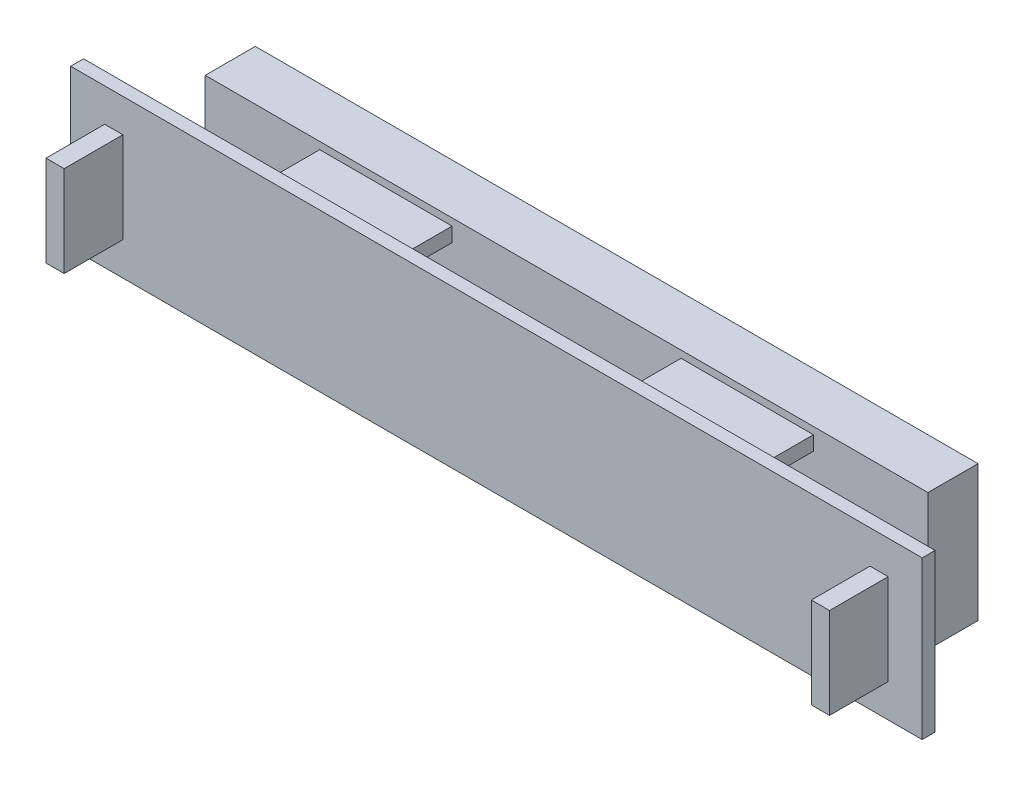
ISO-10303-21;
HEADER;
FILE_DESCRIPTION(('STEP AP214'),'2;1');
FILE_NAME('part.step','',(''),(''),'','','');
FILE_SCHEMA(('AUTOMOTIVE_DESIGN { 1 0 10303 214 1 1 1 1 }'));
ENDSEC;
DATA;
#1=APPLICATION_CONTEXT('core data for automotive mechanical design processes');
#2=APPLICATION_PROTOCOL_DEFINITION('international standard','automotive_design',2000,#1);
#3=PRODUCT_CONTEXT('',#1,'mechanical');
#4=PRODUCT('Part','Part','',(#3));
#5=PRODUCT_RELATED_PRODUCT_CATEGORY('part','',(#4));
#6=PRODUCT_DEFINITION_FORMATION('','',#4);
#7=PRODUCT_DEFINITION_CONTEXT('part definition',#1,'design');
#8=PRODUCT_DEFINITION('design','',#6,#7);
#9=PRODUCT_DEFINITION_SHAPE('','',#8);
#10=(LENGTH_UNIT() NAMED_UNIT(*) SI_UNIT(.MILLI.,.METRE.));
#11=(NAMED_UNIT(*) PLANE_ANGLE_UNIT() SI_UNIT($,.RADIAN.));
#12=(NAMED_UNIT(*) SI_UNIT($,.STERADIAN.) SOLID_ANGLE_UNIT());
#13=UNCERTAINTY_MEASURE_WITH_UNIT(LENGTH_MEASURE(1.E-05),#10,'distance_accuracy_value','');
#14=(GEOMETRIC_REPRESENTATION_CONTEXT(3) GLOBAL_UNCERTAINTY_ASSIGNED_CONTEXT((#13)) GLOBAL_UNIT_ASSIGNED_CONTEXT((#10,
#11,#12)) REPRESENTATION_CONTEXT('',''));
#15=CARTESIAN_POINT('',(0.,0.,0.));
#16=DIRECTION('',(0.,0.,1.));
#17=DIRECTION('',(1.,0.,0.));
#18=AXIS2_PLACEMENT_3D('',#15,#16,#17);
#19=CARTESIAN_POINT('',(0.,0.,15.));
#20=DIRECTION('',(0.,0.,-1.));
#21=DIRECTION('',(-1.,0.,0.));
#22=AXIS2_PLACEMENT_3D('',#19,#20,#21);
#23=PLANE('',#22);
#24=DIRECTION('',(-1.,0.,0.));
#25=VECTOR('',#24,1.);
#26=CARTESIAN_POINT('',(59.5,6.5,15.));
#27=LINE('',#26,#25);
#28=CARTESIAN_POINT('',(-16.,6.5,15.));
#29=VERTEX_POINT('',#28);
#30=CARTESIAN_POINT('',(-34.5,6.5,15.));
#31=VERTEX_POINT('',#30);
#32=EDGE_CURVE('E376',#29,#31,#27,.T.);
#33=ORIENTED_EDGE('',*,*,#32,.F.);
#34=DIRECTION('',(0.,1.,0.));
#35=VECTOR('',#34,1.);
#36=CARTESIAN_POINT('',(-16.,-11.,15.));
#37=LINE('',#36,#35);
#38=CARTESIAN_POINT('',(-16.,8.5,15.));
#39=VERTEX_POINT('',#38);
#40=EDGE_CURVE('E444',#29,#39,#37,.T.);
#41=ORIENTED_EDGE('',*,*,#40,.T.);
#42=DIRECTION('',(-1.,0.,0.));
#43=VECTOR('',#42,1.);
#44=CARTESIAN_POINT('',(59.5,8.5,15.));
#45=LINE('',#44,#43);
#46=CARTESIAN_POINT('',(-34.5,8.5,15.));
#47=VERTEX_POINT('',#46);
#48=EDGE_CURVE('E405',#39,#47,#45,.T.);
#49=ORIENTED_EDGE('',*,*,#48,.T.);
#50=DIRECTION('',(0.,1.,0.));
#51=VECTOR('',#50,1.);
#52=CARTESIAN_POINT('',(-34.5,-11.,15.));
#53=LINE('',#52,#51);
#54=EDGE_CURVE('E421',#31,#47,#53,.T.);
#55=ORIENTED_EDGE('',*,*,#54,.F.);
#56=EDGE_LOOP('',(#33,#41,#49,#55));
#57=FACE_BOUND('',#56,.T.);
#58=DIRECTION('',(0.,1.,0.));
#59=VECTOR('',#58,1.);
#60=CARTESIAN_POINT('',(16.,-11.,15.));
#61=LINE('',#60,#59);
#62=CARTESIAN_POINT('',(16.,6.5,15.));
#63=VERTEX_POINT('',#62);
#64=CARTESIAN_POINT('',(16.,8.5,15.));
#65=VERTEX_POINT('',#64);
#66=EDGE_CURVE('E440',#63,#65,#61,.T.);
#67=ORIENTED_EDGE('',*,*,#66,.F.);
#68=CARTESIAN_POINT('',(34.5,6.5,15.));
#69=VERTEX_POINT('',#68);
#70=EDGE_CURVE('E375',#69,#63,#27,.T.);
#71=ORIENTED_EDGE('',*,*,#70,.F.);
#72=DIRECTION('',(0.,1.,0.));
#73=VECTOR('',#72,1.);
#74=CARTESIAN_POINT('',(34.5,-11.,15.));
#75=LINE('',#74,#73);
#76=CARTESIAN_POINT('',(34.5,8.49999999999999,15.));
#77=VERTEX_POINT('',#76);
#78=EDGE_CURVE('E434',#69,#77,#75,.T.);
#79=ORIENTED_EDGE('',*,*,#78,.T.);
#80=EDGE_CURVE('E408',#77,#65,#45,.T.);
#81=ORIENTED_EDGE('',*,*,#80,.T.);
#82=EDGE_LOOP('',(#67,#71,#79,#81));
#83=FACE_BOUND('',#82,.T.);
#84=DIRECTION('',(-1.,0.,0.));
#85=VECTOR('',#84,1.);
#86=CARTESIAN_POINT('',(59.5,-8.5,15.));
#87=LINE('',#86,#85);
#88=CARTESIAN_POINT('',(-16.,-8.5,15.));
#89=VERTEX_POINT('',#88);
#90=CARTESIAN_POINT('',(-34.5,-8.5,15.));
#91=VERTEX_POINT('',#90);
#92=EDGE_CURVE('E351',#89,#91,#87,.T.);
#93=ORIENTED_EDGE('',*,*,#92,.F.);
#94=CARTESIAN_POINT('',(-16.,-6.5,15.));
#95=VERTEX_POINT('',#94);
#96=EDGE_CURVE('E441',#89,#95,#37,.T.);
#97=ORIENTED_EDGE('',*,*,#96,.T.);
#98=DIRECTION('',(-1.,0.,0.));
#99=VECTOR('',#98,1.);
#100=CARTESIAN_POINT('',(59.5,-6.5,15.));
#101=LINE('',#100,#99);
#102=CARTESIAN_POINT('',(-34.5,-6.5,15.));
#103=VERTEX_POINT('',#102);
#104=EDGE_CURVE('E379',#95,#103,#101,.T.);
#105=ORIENTED_EDGE('',*,*,#104,.T.);
#106=EDGE_CURVE('E429',#91,#103,#53,.T.);
#107=ORIENTED_EDGE('',*,*,#106,.F.);
#108=EDGE_LOOP('',(#93,#97,#105,#107));
#109=FACE_BOUND('',#108,.T.);
#110=DIRECTION('',(-1.,0.,0.));
#111=VECTOR('',#110,1.);
#112=CARTESIAN_POINT('',(-59.5,11.,15.));
#113=LINE('',#112,#111);
#114=CARTESIAN_POINT('',(59.5,11.,15.));
#115=VERTEX_POINT('',#114);
#116=CARTESIAN_POINT('',(-59.5,11.,15.));
#117=VERTEX_POINT('',#116);
#118=EDGE_CURVE('E465',#115,#117,#113,.T.);
#119=ORIENTED_EDGE('',*,*,#118,.F.);
#120=DIRECTION('',(0.,1.,0.));
#121=VECTOR('',#120,1.);
#122=CARTESIAN_POINT('',(59.5,-11.,15.));
#123=LINE('',#122,#121);
#124=CARTESIAN_POINT('',(59.5,-11.,15.));
#125=VERTEX_POINT('',#124);
#126=EDGE_CURVE('E443',#125,#115,#123,.T.);
#127=ORIENTED_EDGE('',*,*,#126,.F.);
#128=DIRECTION('',(1.,0.,0.));
#129=VECTOR('',#128,1.);
#130=CARTESIAN_POINT('',(-59.5,-11.,15.));
#131=LINE('',#130,#129);
#132=CARTESIAN_POINT('',(-59.5,-11.,15.));
#133=VERTEX_POINT('',#132);
#134=EDGE_CURVE('E457',#133,#125,#131,.T.);
#135=ORIENTED_EDGE('',*,*,#134,.F.);
#136=DIRECTION('',(0.,-1.,0.));
#137=VECTOR('',#136,1.);
#138=CARTESIAN_POINT('',(-59.5,-11.,15.));
#139=LINE('',#138,#137);
#140=EDGE_CURVE('E467',#117,#133,#139,.T.);
#141=ORIENTED_EDGE('',*,*,#140,.F.);
#142=EDGE_LOOP('',(#119,#127,#135,#141));
#143=FACE_BOUND('',#142,.T.);
#144=CARTESIAN_POINT('',(16.,-8.5,15.));
#145=VERTEX_POINT('',#144);
#146=CARTESIAN_POINT('',(16.,-6.5,15.));
#147=VERTEX_POINT('',#146);
#148=EDGE_CURVE('E451',#145,#147,#61,.T.);
#149=ORIENTED_EDGE('',*,*,#148,.F.);
#150=CARTESIAN_POINT('',(34.5,-8.5,15.));
#151=VERTEX_POINT('',#150);
#152=EDGE_CURVE('E355',#151,#145,#87,.T.);
#153=ORIENTED_EDGE('',*,*,#152,.F.);
#154=CARTESIAN_POINT('',(34.5,-6.5,15.));
#155=VERTEX_POINT('',#154);
#156=EDGE_CURVE('E431',#151,#155,#75,.T.);
#157=ORIENTED_EDGE('',*,*,#156,.T.);
#158=EDGE_CURVE('E378',#155,#147,#101,.T.);
#159=ORIENTED_EDGE('',*,*,#158,.T.);
#160=EDGE_LOOP('',(#149,#153,#157,#159));
#161=FACE_BOUND('',#160,.T.);
#162=DIRECTION('',(-1.,0.,0.));
#163=VECTOR('',#162,1.);
#164=CARTESIAN_POINT('',(-14.,-5.,15.));
#165=LINE('',#164,#163);
#166=CARTESIAN_POINT('',(14.,-5.,15.));
#167=VERTEX_POINT('',#166);
#168=CARTESIAN_POINT('',(-14.,-5.,15.));
#169=VERTEX_POINT('',#168);
#170=EDGE_CURVE('E333',#167,#169,#165,.T.);
#171=ORIENTED_EDGE('',*,*,#170,.F.);
#172=DIRECTION('',(0.,-1.,0.));
#173=VECTOR('',#172,1.);
#174=CARTESIAN_POINT('',(14.,5.,15.));
#175=LINE('',#174,#173);
#176=CARTESIAN_POINT('',(14.,5.,15.));
#177=VERTEX_POINT('',#176);
#178=EDGE_CURVE('E313',#177,#167,#175,.T.);
#179=ORIENTED_EDGE('',*,*,#178,.F.);
#180=DIRECTION('',(1.,0.,0.));
#181=VECTOR('',#180,1.);
#182=CARTESIAN_POINT('',(-14.,5.,15.));
#183=LINE('',#182,#181);
#184=CARTESIAN_POINT('',(-14.,5.,15.));
#185=VERTEX_POINT('',#184);
#186=EDGE_CURVE('E324',#185,#177,#183,.T.);
#187=ORIENTED_EDGE('',*,*,#186,.F.);
#188=DIRECTION('',(0.,1.,0.));
#189=VECTOR('',#188,1.);
#190=CARTESIAN_POINT('',(-14.,5.,15.));
#191=LINE('',#190,#189);
#192=EDGE_CURVE('E335',#169,#185,#191,.T.);
#193=ORIENTED_EDGE('',*,*,#192,.F.);
#194=EDGE_LOOP('',(#171,#179,#187,#193));
#195=FACE_BOUND('',#194,.T.);
#196=ADVANCED_FACE('F35',(#57,#83,#109,#143,#161,#195),#23,.T.);
#197=CARTESIAN_POINT('',(-16.,-11.,0.));
#198=DIRECTION('',(1.,0.,0.));
#199=DIRECTION('',(0.,0.,-1.));
#200=AXIS2_PLACEMENT_3D('',#197,#198,#199);
#201=PLANE('',#200);
#202=DIRECTION('',(0.,0.,1.));
#203=VECTOR('',#202,1.);
#204=CARTESIAN_POINT('',(-16.,6.5,0.));
#205=LINE('',#204,#203);
#206=CARTESIAN_POINT('',(-16.,6.5,7.));
#207=VERTEX_POINT('',#206);
#208=EDGE_CURVE('E399',#207,#29,#205,.T.);
#209=ORIENTED_EDGE('',*,*,#208,.F.);
#210=DIRECTION('',(0.,1.,0.));
#211=VECTOR('',#210,1.);
#212=CARTESIAN_POINT('',(-16.,-11.,7.));
#213=LINE('',#212,#211);
#214=CARTESIAN_POINT('',(-16.,8.5,7.));
#215=VERTEX_POINT('',#214);
#216=EDGE_CURVE('E447',#207,#215,#213,.T.);
#217=ORIENTED_EDGE('',*,*,#216,.T.);
#218=DIRECTION('',(0.,0.,-1.));
#219=VECTOR('',#218,1.);
#220=CARTESIAN_POINT('',(-16.,8.5,0.));
#221=LINE('',#220,#219);
#222=EDGE_CURVE('E418',#39,#215,#221,.T.);
#223=ORIENTED_EDGE('',*,*,#222,.F.);
#224=ORIENTED_EDGE('',*,*,#40,.F.);
#225=EDGE_LOOP('',(#209,#217,#223,#224));
#226=FACE_BOUND('',#225,.T.);
#227=ADVANCED_FACE('F535',(#226),#201,.T.);
#228=CARTESIAN_POINT('',(16.,-11.,0.));
#229=DIRECTION('',(1.,0.,0.));
#230=DIRECTION('',(0.,0.,-1.));
#231=AXIS2_PLACEMENT_3D('',#228,#229,#230);
#232=PLANE('',#231);
#233=DIRECTION('',(0.,1.,0.));
#234=VECTOR('',#233,1.);
#235=CARTESIAN_POINT('',(16.,-11.,6.99999999999999));
#236=LINE('',#235,#234);
#237=CARTESIAN_POINT('',(16.,6.5,7.));
#238=VERTEX_POINT('',#237);
#239=CARTESIAN_POINT('',(16.,8.5,7.));
#240=VERTEX_POINT('',#239);
#241=EDGE_CURVE('E450',#238,#240,#236,.T.);
#242=ORIENTED_EDGE('',*,*,#241,.F.);
#243=DIRECTION('',(0.,0.,1.));
#244=VECTOR('',#243,1.);
#245=CARTESIAN_POINT('',(16.,6.5,0.));
#246=LINE('',#245,#244);
#247=EDGE_CURVE('E396',#238,#63,#246,.T.);
#248=ORIENTED_EDGE('',*,*,#247,.T.);
#249=ORIENTED_EDGE('',*,*,#66,.T.);
#250=DIRECTION('',(0.,0.,-1.));
#251=VECTOR('',#250,1.);
#252=CARTESIAN_POINT('',(16.,8.5,0.));
#253=LINE('',#252,#251);
#254=EDGE_CURVE('E415',#65,#240,#253,.T.);
#255=ORIENTED_EDGE('',*,*,#254,.T.);
#256=EDGE_LOOP('',(#242,#248,#249,#255));
#257=FACE_BOUND('',#256,.T.);
#258=ADVANCED_FACE('F541',(#257),#232,.F.);
#259=CARTESIAN_POINT('',(34.5,-11.,0.));
#260=DIRECTION('',(1.,0.,0.));
#261=DIRECTION('',(0.,0.,-1.));
#262=AXIS2_PLACEMENT_3D('',#259,#260,#261);
#263=PLANE('',#262);
#264=DIRECTION('',(0.,0.,1.));
#265=VECTOR('',#264,1.);
#266=CARTESIAN_POINT('',(34.5,6.5,0.));
#267=LINE('',#266,#265);
#268=CARTESIAN_POINT('',(34.5,6.5,7.));
#269=VERTEX_POINT('',#268);
#270=EDGE_CURVE('E394',#269,#69,#267,.T.);
#271=ORIENTED_EDGE('',*,*,#270,.F.);
#272=DIRECTION('',(0.,1.,0.));
#273=VECTOR('',#272,1.);
#274=CARTESIAN_POINT('',(34.5,-11.,6.99999999999999));
#275=LINE('',#274,#273);
#276=CARTESIAN_POINT('',(34.5,8.5,7.));
#277=VERTEX_POINT('',#276);
#278=EDGE_CURVE('E437',#269,#277,#275,.T.);
#279=ORIENTED_EDGE('',*,*,#278,.T.);
#280=DIRECTION('',(0.,0.,-1.));
#281=VECTOR('',#280,1.);
#282=CARTESIAN_POINT('',(34.5,8.5,0.));
#283=LINE('',#282,#281);
#284=EDGE_CURVE('E412',#77,#277,#283,.T.);
#285=ORIENTED_EDGE('',*,*,#284,.F.);
#286=ORIENTED_EDGE('',*,*,#78,.F.);
#287=EDGE_LOOP('',(#271,#279,#285,#286));
#288=FACE_BOUND('',#287,.T.);
#289=ADVANCED_FACE('F584',(#288),#263,.T.);
#290=CARTESIAN_POINT('',(-34.5,-11.,0.));
#291=DIRECTION('',(1.,0.,0.));
#292=DIRECTION('',(0.,0.,-1.));
#293=AXIS2_PLACEMENT_3D('',#290,#291,#292);
#294=PLANE('',#293);
#295=DIRECTION('',(0.,1.,0.));
#296=VECTOR('',#295,1.);
#297=CARTESIAN_POINT('',(-34.5,-11.,7.));
#298=LINE('',#297,#296);
#299=CARTESIAN_POINT('',(-34.5,6.5,7.));
#300=VERTEX_POINT('',#299);
#301=CARTESIAN_POINT('',(-34.5,8.49999999999999,7.));
#302=VERTEX_POINT('',#301);
#303=EDGE_CURVE('E428',#300,#302,#298,.T.);
#304=ORIENTED_EDGE('',*,*,#303,.F.);
#305=DIRECTION('',(0.,0.,-1.));
#306=VECTOR('',#305,1.);
#307=CARTESIAN_POINT('',(-34.5,6.5,7.));
#308=LINE('',#307,#306);
#309=EDGE_CURVE('E368',#31,#300,#308,.T.);
#310=ORIENTED_EDGE('',*,*,#309,.F.);
#311=ORIENTED_EDGE('',*,*,#54,.T.);
#312=DIRECTION('',(0.,0.,1.));
#313=VECTOR('',#312,1.);
#314=CARTESIAN_POINT('',(-34.5,8.5,7.));
#315=LINE('',#314,#313);
#316=EDGE_CURVE('E401',#302,#47,#315,.T.);
#317=ORIENTED_EDGE('',*,*,#316,.F.);
#318=EDGE_LOOP('',(#304,#310,#311,#317));
#319=FACE_BOUND('',#318,.T.);
#320=ADVANCED_FACE('F579',(#319),#294,.F.);
#321=CARTESIAN_POINT('',(-50.5,9.5,15.));
#322=DIRECTION('',(0.,-1.,0.));
#323=DIRECTION('',(0.,0.,-1.));
#324=AXIS2_PLACEMENT_3D('',#321,#322,#323);
#325=PLANE('',#324);
#326=DIRECTION('',(0.,0.,-1.));
#327=VECTOR('',#326,1.);
#328=CARTESIAN_POINT('',(-50.5,9.5,15.));
#329=LINE('',#328,#327);
#330=CARTESIAN_POINT('',(-50.5,9.5,7.));
#331=VERTEX_POINT('',#330);
#332=CARTESIAN_POINT('',(-50.5,9.5,0.));
#333=VERTEX_POINT('',#332);
#334=EDGE_CURVE('E497',#331,#333,#329,.T.);
#335=ORIENTED_EDGE('',*,*,#334,.F.);
#336=DIRECTION('',(-1.,0.,0.));
#337=VECTOR('',#336,1.);
#338=CARTESIAN_POINT('',(0.,9.5,6.99999999999999));
#339=LINE('',#338,#337);
#340=CARTESIAN_POINT('',(50.5,9.5,6.99999999999999));
#341=VERTEX_POINT('',#340);
#342=EDGE_CURVE('E433',#341,#331,#339,.T.);
#343=ORIENTED_EDGE('',*,*,#342,.F.);
#344=DIRECTION('',(0.,0.,-1.));
#345=VECTOR('',#344,1.);
#346=CARTESIAN_POINT('',(50.5,9.5,15.));
#347=LINE('',#346,#345);
#348=CARTESIAN_POINT('',(50.5,9.5,0.));
#349=VERTEX_POINT('',#348);
#350=EDGE_CURVE('E499',#341,#349,#347,.T.);
#351=ORIENTED_EDGE('',*,*,#350,.T.);
#352=DIRECTION('',(-1.,0.,0.));
#353=VECTOR('',#352,1.);
#354=CARTESIAN_POINT('',(-50.5,9.5,0.));
#355=LINE('',#354,#353);
#356=EDGE_CURVE('E484',#349,#333,#355,.T.);
#357=ORIENTED_EDGE('',*,*,#356,.T.);
#358=EDGE_LOOP('',(#335,#343,#351,#357));
#359=FACE_BOUND('',#358,.T.);
#360=ADVANCED_FACE('F574',(#359),#325,.F.);
#361=CARTESIAN_POINT('',(-50.5,-9.5,15.));
#362=DIRECTION('',(0.,1.,0.));
#363=DIRECTION('',(0.,0.,1.));
#364=AXIS2_PLACEMENT_3D('',#361,#362,#363);
#365=PLANE('',#364);
#366=DIRECTION('',(0.,0.,-1.));
#367=VECTOR('',#366,1.);
#368=CARTESIAN_POINT('',(50.5,-9.5,15.));
#369=LINE('',#368,#367);
#370=CARTESIAN_POINT('',(50.5,-9.5,6.99999999999999));
#371=VERTEX_POINT('',#370);
#372=CARTESIAN_POINT('',(50.5,-9.5,0.));
#373=VERTEX_POINT('',#372);
#374=EDGE_CURVE('E493',#371,#373,#369,.T.);
#375=ORIENTED_EDGE('',*,*,#374,.F.);
#376=DIRECTION('',(-1.,0.,0.));
#377=VECTOR('',#376,1.);
#378=CARTESIAN_POINT('',(-50.5,-9.5,7.));
#379=LINE('',#378,#377);
#380=CARTESIAN_POINT('',(-50.5,-9.5,7.));
#381=VERTEX_POINT('',#380);
#382=EDGE_CURVE('E501',#371,#381,#379,.T.);
#383=ORIENTED_EDGE('',*,*,#382,.T.);
#384=DIRECTION('',(0.,0.,-1.));
#385=VECTOR('',#384,1.);
#386=CARTESIAN_POINT('',(-50.5,-9.5,15.));
#387=LINE('',#386,#385);
#388=CARTESIAN_POINT('',(-50.5,-9.5,0.));
#389=VERTEX_POINT('',#388);
#390=EDGE_CURVE('E495',#381,#389,#387,.T.);
#391=ORIENTED_EDGE('',*,*,#390,.T.);
#392=DIRECTION('',(1.,0.,0.));
#393=VECTOR('',#392,1.);
#394=CARTESIAN_POINT('',(-50.5,-9.5,0.));
#395=LINE('',#394,#393);
#396=EDGE_CURVE('E490',#389,#373,#395,.T.);
#397=ORIENTED_EDGE('',*,*,#396,.T.);
#398=EDGE_LOOP('',(#375,#383,#391,#397));
#399=FACE_BOUND('',#398,.T.);
#400=ADVANCED_FACE('F570',(#399),#365,.F.);
#401=CARTESIAN_POINT('',(-50.5,-9.5,15.));
#402=DIRECTION('',(1.,0.,0.));
#403=DIRECTION('',(0.,0.,-1.));
#404=AXIS2_PLACEMENT_3D('',#401,#402,#403);
#405=PLANE('',#404);
#406=DIRECTION('',(0.,1.,0.));
#407=VECTOR('',#406,1.);
#408=CARTESIAN_POINT('',(-50.5,-11.,7.));
#409=LINE('',#408,#407);
#410=EDGE_CURVE('E422',#381,#331,#409,.T.);
#411=ORIENTED_EDGE('',*,*,#410,.T.);
#412=ORIENTED_EDGE('',*,*,#334,.T.);
#413=DIRECTION('',(0.,-1.,0.));
#414=VECTOR('',#413,1.);
#415=CARTESIAN_POINT('',(-50.5,-9.5,0.));
#416=LINE('',#415,#414);
#417=EDGE_CURVE('E487',#333,#389,#416,.T.);
#418=ORIENTED_EDGE('',*,*,#417,.T.);
#419=ORIENTED_EDGE('',*,*,#390,.F.);
#420=EDGE_LOOP('',(#411,#412,#418,#419));
#421=FACE_BOUND('',#420,.T.);
#422=ADVANCED_FACE('F573',(#421),#405,.F.);
#423=CARTESIAN_POINT('',(50.5,-9.5,15.));
#424=DIRECTION('',(-1.,0.,0.));
#425=DIRECTION('',(0.,0.,1.));
#426=AXIS2_PLACEMENT_3D('',#423,#424,#425);
#427=PLANE('',#426);
#428=ORIENTED_EDGE('',*,*,#350,.F.);
#429=DIRECTION('',(0.,1.,0.));
#430=VECTOR('',#429,1.);
#431=CARTESIAN_POINT('',(50.5,-11.,6.99999999999999));
#432=LINE('',#431,#430);
#433=EDGE_CURVE('E425',#371,#341,#432,.T.);
#434=ORIENTED_EDGE('',*,*,#433,.F.);
#435=ORIENTED_EDGE('',*,*,#374,.T.);
#436=DIRECTION('',(0.,1.,0.));
#437=VECTOR('',#436,1.);
#438=CARTESIAN_POINT('',(50.5,-9.5,0.));
#439=LINE('',#438,#437);
#440=EDGE_CURVE('E481',#373,#349,#439,.T.);
#441=ORIENTED_EDGE('',*,*,#440,.T.);
#442=EDGE_LOOP('',(#428,#434,#435,#441));
#443=FACE_BOUND('',#442,.T.);
#444=ADVANCED_FACE('F37',(#443),#427,.F.);
#445=CARTESIAN_POINT('',(0.,0.,0.));
#446=DIRECTION('',(0.,0.,-1.));
#447=DIRECTION('',(-1.,0.,0.));
#448=AXIS2_PLACEMENT_3D('',#445,#446,#447);
#449=PLANE('',#448);
#450=ORIENTED_EDGE('',*,*,#440,.F.);
#451=ORIENTED_EDGE('',*,*,#396,.F.);
#452=ORIENTED_EDGE('',*,*,#417,.F.);
#453=ORIENTED_EDGE('',*,*,#356,.F.);
#454=EDGE_LOOP('',(#450,#451,#452,#453));
#455=FACE_BOUND('',#454,.T.);
#456=ADVANCED_FACE('F565',(#455),#449,.T.);
#457=CARTESIAN_POINT('',(59.5,-11.,16.8));
#458=DIRECTION('',(-1.,0.,0.));
#459=DIRECTION('',(0.,0.,1.));
#460=AXIS2_PLACEMENT_3D('',#457,#458,#459);
#461=PLANE('',#460);
#462=ORIENTED_EDGE('',*,*,#126,.T.);
#463=DIRECTION('',(0.,0.,-1.));
#464=VECTOR('',#463,1.);
#465=CARTESIAN_POINT('',(59.5,11.,16.8));
#466=LINE('',#465,#464);
#467=CARTESIAN_POINT('',(59.5,11.,16.8));
#468=VERTEX_POINT('',#467);
#469=EDGE_CURVE('E478',#468,#115,#466,.T.);
#470=ORIENTED_EDGE('',*,*,#469,.F.);
#471=DIRECTION('',(0.,1.,0.));
#472=VECTOR('',#471,1.);
#473=CARTESIAN_POINT('',(59.5,-11.,16.8));
#474=LINE('',#473,#472);
#475=CARTESIAN_POINT('',(59.5,-11.,16.8));
#476=VERTEX_POINT('',#475);
#477=EDGE_CURVE('E453',#476,#468,#474,.T.);
#478=ORIENTED_EDGE('',*,*,#477,.F.);
#479=DIRECTION('',(0.,0.,-1.));
#480=VECTOR('',#479,1.);
#481=CARTESIAN_POINT('',(59.5,-11.,16.8));
#482=LINE('',#481,#480);
#483=EDGE_CURVE('E463',#476,#125,#482,.T.);
#484=ORIENTED_EDGE('',*,*,#483,.T.);
#485=EDGE_LOOP('',(#462,#470,#478,#484));
#486=FACE_BOUND('',#485,.T.);
#487=ADVANCED_FACE('F561',(#486),#461,.F.);
#488=CARTESIAN_POINT('',(-59.5,11.,16.8));
#489=DIRECTION('',(0.,-1.,0.));
#490=DIRECTION('',(0.,0.,-1.));
#491=AXIS2_PLACEMENT_3D('',#488,#489,#490);
#492=PLANE('',#491);
#493=ORIENTED_EDGE('',*,*,#118,.T.);
#494=DIRECTION('',(0.,0.,-1.));
#495=VECTOR('',#494,1.);
#496=CARTESIAN_POINT('',(-59.5,11.,16.8));
#497=LINE('',#496,#495);
#498=CARTESIAN_POINT('',(-59.5,11.,16.8));
#499=VERTEX_POINT('',#498);
#500=EDGE_CURVE('E475',#499,#117,#497,.T.);
#501=ORIENTED_EDGE('',*,*,#500,.F.);
#502=DIRECTION('',(-1.,0.,0.));
#503=VECTOR('',#502,1.);
#504=CARTESIAN_POINT('',(-59.5,11.,16.8));
#505=LINE('',#504,#503);
#506=EDGE_CURVE('E456',#468,#499,#505,.T.);
#507=ORIENTED_EDGE('',*,*,#506,.F.);
#508=ORIENTED_EDGE('',*,*,#469,.T.);
#509=EDGE_LOOP('',(#493,#501,#507,#508));
#510=FACE_BOUND('',#509,.T.);
#511=ADVANCED_FACE('F557',(#510),#492,.F.);
#512=CARTESIAN_POINT('',(-59.5,-11.,16.8));
#513=DIRECTION('',(1.,0.,0.));
#514=DIRECTION('',(0.,0.,-1.));
#515=AXIS2_PLACEMENT_3D('',#512,#513,#514);
#516=PLANE('',#515);
#517=ORIENTED_EDGE('',*,*,#140,.T.);
#518=DIRECTION('',(0.,0.,-1.));
#519=VECTOR('',#518,1.);
#520=CARTESIAN_POINT('',(-59.5,-11.,16.8));
#521=LINE('',#520,#519);
#522=CARTESIAN_POINT('',(-59.5,-11.,16.8));
#523=VERTEX_POINT('',#522);
#524=EDGE_CURVE('E472',#523,#133,#521,.T.);
#525=ORIENTED_EDGE('',*,*,#524,.F.);
#526=DIRECTION('',(0.,-1.,0.));
#527=VECTOR('',#526,1.);
#528=CARTESIAN_POINT('',(-59.5,-11.,16.8));
#529=LINE('',#528,#527);
#530=EDGE_CURVE('E459',#499,#523,#529,.T.);
#531=ORIENTED_EDGE('',*,*,#530,.F.);
#532=ORIENTED_EDGE('',*,*,#500,.T.);
#533=EDGE_LOOP('',(#517,#525,#531,#532));
#534=FACE_BOUND('',#533,.T.);
#535=ADVANCED_FACE('F553',(#534),#516,.F.);
#536=CARTESIAN_POINT('',(-59.5,-11.,16.8));
#537=DIRECTION('',(0.,1.,0.));
#538=DIRECTION('',(0.,0.,1.));
#539=AXIS2_PLACEMENT_3D('',#536,#537,#538);
#540=PLANE('',#539);
#541=ORIENTED_EDGE('',*,*,#134,.T.);
#542=ORIENTED_EDGE('',*,*,#483,.F.);
#543=DIRECTION('',(1.,0.,0.));
#544=VECTOR('',#543,1.);
#545=CARTESIAN_POINT('',(-59.5,-11.,16.8));
#546=LINE('',#545,#544);
#547=EDGE_CURVE('E461',#523,#476,#546,.T.);
#548=ORIENTED_EDGE('',*,*,#547,.F.);
#549=ORIENTED_EDGE('',*,*,#524,.T.);
#550=EDGE_LOOP('',(#541,#542,#548,#549));
#551=FACE_BOUND('',#550,.T.);
#552=ADVANCED_FACE('F550',(#551),#540,.F.);
#553=CARTESIAN_POINT('',(0.,0.,16.8));
#554=DIRECTION('',(0.,0.,-1.));
#555=DIRECTION('',(-1.,0.,0.));
#556=AXIS2_PLACEMENT_3D('',#553,#554,#555);
#557=PLANE('',#556);
#558=DIRECTION('',(0.,1.,0.));
#559=VECTOR('',#558,1.);
#560=CARTESIAN_POINT('',(-54.75,0.,16.8));
#561=LINE('',#560,#559);
#562=CARTESIAN_POINT('',(-54.75,-6.35,16.8));
#563=VERTEX_POINT('',#562);
#564=CARTESIAN_POINT('',(-54.75,6.35,16.8));
#565=VERTEX_POINT('',#564);
#566=EDGE_CURVE('E43',#563,#565,#561,.T.);
#567=ORIENTED_EDGE('',*,*,#566,.T.);
#568=DIRECTION('',(1.,0.,0.));
#569=VECTOR('',#568,1.);
#570=CARTESIAN_POINT('',(0.,6.35,16.8));
#571=LINE('',#570,#569);
#572=CARTESIAN_POINT('',(-52.21,6.35,16.8));
#573=VERTEX_POINT('',#572);
#574=EDGE_CURVE('E11',#565,#573,#571,.T.);
#575=ORIENTED_EDGE('',*,*,#574,.T.);
#576=DIRECTION('',(0.,-1.,0.));
#577=VECTOR('',#576,1.);
#578=CARTESIAN_POINT('',(-52.21,0.,16.8));
#579=LINE('',#578,#577);
#580=CARTESIAN_POINT('',(-52.21,-6.35,16.8));
#581=VERTEX_POINT('',#580);
#582=EDGE_CURVE('E271',#573,#581,#579,.T.);
#583=ORIENTED_EDGE('',*,*,#582,.T.);
#584=DIRECTION('',(-1.,0.,0.));
#585=VECTOR('',#584,1.);
#586=CARTESIAN_POINT('',(0.,-6.35,16.8));
#587=LINE('',#586,#585);
#588=EDGE_CURVE('E516',#581,#563,#587,.T.);
#589=ORIENTED_EDGE('',*,*,#588,.T.);
#590=EDGE_LOOP('',(#567,#575,#583,#589));
#591=FACE_BOUND('',#590,.T.);
#592=DIRECTION('',(1.,0.,0.));
#593=VECTOR('',#592,1.);
#594=CARTESIAN_POINT('',(0.,6.35,16.8));
#595=LINE('',#594,#593);
#596=CARTESIAN_POINT('',(52.21,6.35,16.8));
#597=VERTEX_POINT('',#596);
#598=CARTESIAN_POINT('',(54.75,6.35,16.8));
#599=VERTEX_POINT('',#598);
#600=EDGE_CURVE('E509',#597,#599,#595,.T.);
#601=ORIENTED_EDGE('',*,*,#600,.T.);
#602=DIRECTION('',(0.,-1.,0.));
#603=VECTOR('',#602,1.);
#604=CARTESIAN_POINT('',(54.75,0.,16.8));
#605=LINE('',#604,#603);
#606=CARTESIAN_POINT('',(54.75,-6.35,16.8));
#607=VERTEX_POINT('',#606);
#608=EDGE_CURVE('E512',#599,#607,#605,.T.);
#609=ORIENTED_EDGE('',*,*,#608,.T.);
#610=DIRECTION('',(-1.,0.,0.));
#611=VECTOR('',#610,1.);
#612=CARTESIAN_POINT('',(0.,-6.35,16.8));
#613=LINE('',#612,#611);
#614=CARTESIAN_POINT('',(52.21,-6.35,16.8));
#615=VERTEX_POINT('',#614);
#616=EDGE_CURVE('E503',#607,#615,#613,.T.);
#617=ORIENTED_EDGE('',*,*,#616,.T.);
#618=DIRECTION('',(0.,1.,0.));
#619=VECTOR('',#618,1.);
#620=CARTESIAN_POINT('',(52.21,0.,16.8));
#621=LINE('',#620,#619);
#622=EDGE_CURVE('E506',#615,#597,#621,.T.);
#623=ORIENTED_EDGE('',*,*,#622,.T.);
#624=EDGE_LOOP('',(#601,#609,#617,#623));
#625=FACE_BOUND('',#624,.T.);
#626=ORIENTED_EDGE('',*,*,#477,.T.);
#627=ORIENTED_EDGE('',*,*,#506,.T.);
#628=ORIENTED_EDGE('',*,*,#530,.T.);
#629=ORIENTED_EDGE('',*,*,#547,.T.);
#630=EDGE_LOOP('',(#626,#627,#628,#629));
#631=FACE_BOUND('',#630,.T.);
#632=ADVANCED_FACE('F520',(#591,#625,#631),#557,.F.);
#633=CARTESIAN_POINT('',(0.,-11.,6.99999999999999));
#634=DIRECTION('',(0.,0.,-1.));
#635=DIRECTION('',(-1.,0.,0.));
#636=AXIS2_PLACEMENT_3D('',#633,#634,#635);
#637=PLANE('',#636);
#638=DIRECTION('',(-1.,0.,0.));
#639=VECTOR('',#638,1.);
#640=CARTESIAN_POINT('',(59.5,-8.5,7.));
#641=LINE('',#640,#639);
#642=CARTESIAN_POINT('',(34.5,-8.5,7.));
#643=VERTEX_POINT('',#642);
#644=CARTESIAN_POINT('',(16.,-8.5,7.));
#645=VERTEX_POINT('',#644);
#646=EDGE_CURVE('E354',#643,#645,#641,.T.);
#647=ORIENTED_EDGE('',*,*,#646,.T.);
#648=CARTESIAN_POINT('',(16.,-6.5,6.99999999999999));
#649=VERTEX_POINT('',#648);
#650=EDGE_CURVE('E448',#645,#649,#236,.T.);
#651=ORIENTED_EDGE('',*,*,#650,.T.);
#652=DIRECTION('',(-1.,0.,0.));
#653=VECTOR('',#652,1.);
#654=CARTESIAN_POINT('',(59.5,-6.5,7.));
#655=LINE('',#654,#653);
#656=CARTESIAN_POINT('',(34.5,-6.5,7.));
#657=VERTEX_POINT('',#656);
#658=EDGE_CURVE('E382',#657,#649,#655,.T.);
#659=ORIENTED_EDGE('',*,*,#658,.F.);
#660=EDGE_CURVE('E435',#643,#657,#275,.T.);
#661=ORIENTED_EDGE('',*,*,#660,.F.);
#662=EDGE_LOOP('',(#647,#651,#659,#661));
#663=FACE_BOUND('',#662,.T.);
#664=ORIENTED_EDGE('',*,*,#433,.T.);
#665=ORIENTED_EDGE('',*,*,#342,.T.);
#666=ORIENTED_EDGE('',*,*,#410,.F.);
#667=ORIENTED_EDGE('',*,*,#382,.F.);
#668=EDGE_LOOP('',(#664,#665,#666,#667));
#669=FACE_BOUND('',#668,.T.);
#670=DIRECTION('',(-1.,0.,0.));
#671=VECTOR('',#670,1.);
#672=CARTESIAN_POINT('',(59.5,6.5,7.));
#673=LINE('',#672,#671);
#674=EDGE_CURVE('E374',#269,#238,#673,.T.);
#675=ORIENTED_EDGE('',*,*,#674,.T.);
#676=ORIENTED_EDGE('',*,*,#241,.T.);
#677=DIRECTION('',(-1.,0.,0.));
#678=VECTOR('',#677,1.);
#679=CARTESIAN_POINT('',(59.5,8.5,7.));
#680=LINE('',#679,#678);
#681=EDGE_CURVE('E409',#277,#240,#680,.T.);
#682=ORIENTED_EDGE('',*,*,#681,.F.);
#683=ORIENTED_EDGE('',*,*,#278,.F.);
#684=EDGE_LOOP('',(#675,#676,#682,#683));
#685=FACE_BOUND('',#684,.T.);
#686=CARTESIAN_POINT('',(-16.,-8.5,7.));
#687=VERTEX_POINT('',#686);
#688=CARTESIAN_POINT('',(-16.,-6.5,7.));
#689=VERTEX_POINT('',#688);
#690=EDGE_CURVE('E445',#687,#689,#213,.T.);
#691=ORIENTED_EDGE('',*,*,#690,.F.);
#692=CARTESIAN_POINT('',(-34.5,-8.5,7.));
#693=VERTEX_POINT('',#692);
#694=EDGE_CURVE('E352',#687,#693,#641,.T.);
#695=ORIENTED_EDGE('',*,*,#694,.T.);
#696=CARTESIAN_POINT('',(-34.5,-6.5,7.));
#697=VERTEX_POINT('',#696);
#698=EDGE_CURVE('E426',#693,#697,#298,.T.);
#699=ORIENTED_EDGE('',*,*,#698,.T.);
#700=EDGE_CURVE('E371',#689,#697,#655,.T.);
#701=ORIENTED_EDGE('',*,*,#700,.F.);
#702=EDGE_LOOP('',(#691,#695,#699,#701));
#703=FACE_BOUND('',#702,.T.);
#704=ORIENTED_EDGE('',*,*,#216,.F.);
#705=EDGE_CURVE('E372',#207,#300,#673,.T.);
#706=ORIENTED_EDGE('',*,*,#705,.T.);
#707=ORIENTED_EDGE('',*,*,#303,.T.);
#708=EDGE_CURVE('E404',#215,#302,#680,.T.);
#709=ORIENTED_EDGE('',*,*,#708,.F.);
#710=EDGE_LOOP('',(#704,#706,#707,#709));
#711=FACE_BOUND('',#710,.T.);
#712=ADVANCED_FACE('F597',(#663,#669,#685,#703,#711),#637,.F.);
#713=DIRECTION('',(0.,0.,1.));
#714=VECTOR('',#713,1.);
#715=CARTESIAN_POINT('',(-16.,-8.5,0.));
#716=LINE('',#715,#714);
#717=EDGE_CURVE('E363',#687,#89,#716,.T.);
#718=ORIENTED_EDGE('',*,*,#717,.F.);
#719=ORIENTED_EDGE('',*,*,#690,.T.);
#720=DIRECTION('',(0.,0.,-1.));
#721=VECTOR('',#720,1.);
#722=CARTESIAN_POINT('',(-16.,-6.5,0.));
#723=LINE('',#722,#721);
#724=EDGE_CURVE('E391',#95,#689,#723,.T.);
#725=ORIENTED_EDGE('',*,*,#724,.F.);
#726=ORIENTED_EDGE('',*,*,#96,.F.);
#727=EDGE_LOOP('',(#718,#719,#725,#726));
#728=FACE_BOUND('',#727,.T.);
#729=ADVANCED_FACE('F544',(#728),#201,.T.);
#730=ORIENTED_EDGE('',*,*,#650,.F.);
#731=DIRECTION('',(0.,0.,1.));
#732=VECTOR('',#731,1.);
#733=CARTESIAN_POINT('',(16.,-8.5,0.));
#734=LINE('',#733,#732);
#735=EDGE_CURVE('E360',#645,#145,#734,.T.);
#736=ORIENTED_EDGE('',*,*,#735,.T.);
#737=ORIENTED_EDGE('',*,*,#148,.T.);
#738=DIRECTION('',(0.,0.,-1.));
#739=VECTOR('',#738,1.);
#740=CARTESIAN_POINT('',(16.,-6.5,0.));
#741=LINE('',#740,#739);
#742=EDGE_CURVE('E388',#147,#649,#741,.T.);
#743=ORIENTED_EDGE('',*,*,#742,.T.);
#744=EDGE_LOOP('',(#730,#736,#737,#743));
#745=FACE_BOUND('',#744,.T.);
#746=ADVANCED_FACE('F650',(#745),#232,.F.);
#747=DIRECTION('',(0.,0.,1.));
#748=VECTOR('',#747,1.);
#749=CARTESIAN_POINT('',(34.5,-8.5,0.));
#750=LINE('',#749,#748);
#751=EDGE_CURVE('E357',#643,#151,#750,.T.);
#752=ORIENTED_EDGE('',*,*,#751,.F.);
#753=ORIENTED_EDGE('',*,*,#660,.T.);
#754=DIRECTION('',(0.,0.,-1.));
#755=VECTOR('',#754,1.);
#756=CARTESIAN_POINT('',(34.5,-6.5,0.));
#757=LINE('',#756,#755);
#758=EDGE_CURVE('E385',#155,#657,#757,.T.);
#759=ORIENTED_EDGE('',*,*,#758,.F.);
#760=ORIENTED_EDGE('',*,*,#156,.F.);
#761=EDGE_LOOP('',(#752,#753,#759,#760));
#762=FACE_BOUND('',#761,.T.);
#763=ADVANCED_FACE('F657',(#762),#263,.T.);
#764=ORIENTED_EDGE('',*,*,#698,.F.);
#765=DIRECTION('',(0.,0.,-1.));
#766=VECTOR('',#765,1.);
#767=CARTESIAN_POINT('',(-34.5,-8.5,7.));
#768=LINE('',#767,#766);
#769=EDGE_CURVE('E348',#91,#693,#768,.T.);
#770=ORIENTED_EDGE('',*,*,#769,.F.);
#771=ORIENTED_EDGE('',*,*,#106,.T.);
#772=DIRECTION('',(0.,0.,1.));
#773=VECTOR('',#772,1.);
#774=CARTESIAN_POINT('',(-34.5,-6.5,7.));
#775=LINE('',#774,#773);
#776=EDGE_CURVE('E365',#697,#103,#775,.T.);
#777=ORIENTED_EDGE('',*,*,#776,.F.);
#778=EDGE_LOOP('',(#764,#770,#771,#777));
#779=FACE_BOUND('',#778,.T.);
#780=ADVANCED_FACE('F587',(#779),#294,.F.);
#781=CARTESIAN_POINT('',(59.5,8.5,7.));
#782=DIRECTION('',(0.,-1.,0.));
#783=DIRECTION('',(0.,0.,-1.));
#784=AXIS2_PLACEMENT_3D('',#781,#782,#783);
#785=PLANE('',#784);
#786=ORIENTED_EDGE('',*,*,#222,.T.);
#787=ORIENTED_EDGE('',*,*,#708,.T.);
#788=ORIENTED_EDGE('',*,*,#316,.T.);
#789=ORIENTED_EDGE('',*,*,#48,.F.);
#790=EDGE_LOOP('',(#786,#787,#788,#789));
#791=FACE_BOUND('',#790,.T.);
#792=ADVANCED_FACE('F671',(#791),#785,.F.);
#793=ORIENTED_EDGE('',*,*,#80,.F.);
#794=ORIENTED_EDGE('',*,*,#284,.T.);
#795=ORIENTED_EDGE('',*,*,#681,.T.);
#796=ORIENTED_EDGE('',*,*,#254,.F.);
#797=EDGE_LOOP('',(#793,#794,#795,#796));
#798=FACE_BOUND('',#797,.T.);
#799=ADVANCED_FACE('F678',(#798),#785,.F.);
#800=CARTESIAN_POINT('',(59.5,-6.5,7.));
#801=DIRECTION('',(0.,-1.,0.));
#802=DIRECTION('',(0.,0.,-1.));
#803=AXIS2_PLACEMENT_3D('',#800,#801,#802);
#804=PLANE('',#803);
#805=ORIENTED_EDGE('',*,*,#724,.T.);
#806=ORIENTED_EDGE('',*,*,#700,.T.);
#807=ORIENTED_EDGE('',*,*,#776,.T.);
#808=ORIENTED_EDGE('',*,*,#104,.F.);
#809=EDGE_LOOP('',(#805,#806,#807,#808));
#810=FACE_BOUND('',#809,.T.);
#811=ADVANCED_FACE('F686',(#810),#804,.F.);
#812=CARTESIAN_POINT('',(59.5,6.5,7.));
#813=DIRECTION('',(0.,1.,0.));
#814=DIRECTION('',(0.,0.,1.));
#815=AXIS2_PLACEMENT_3D('',#812,#813,#814);
#816=PLANE('',#815);
#817=ORIENTED_EDGE('',*,*,#208,.T.);
#818=ORIENTED_EDGE('',*,*,#32,.T.);
#819=ORIENTED_EDGE('',*,*,#309,.T.);
#820=ORIENTED_EDGE('',*,*,#705,.F.);
#821=EDGE_LOOP('',(#817,#818,#819,#820));
#822=FACE_BOUND('',#821,.T.);
#823=ADVANCED_FACE('F693',(#822),#816,.F.);
#824=ORIENTED_EDGE('',*,*,#674,.F.);
#825=ORIENTED_EDGE('',*,*,#270,.T.);
#826=ORIENTED_EDGE('',*,*,#70,.T.);
#827=ORIENTED_EDGE('',*,*,#247,.F.);
#828=EDGE_LOOP('',(#824,#825,#826,#827));
#829=FACE_BOUND('',#828,.T.);
#830=ADVANCED_FACE('F702',(#829),#816,.F.);
#831=ORIENTED_EDGE('',*,*,#158,.F.);
#832=ORIENTED_EDGE('',*,*,#758,.T.);
#833=ORIENTED_EDGE('',*,*,#658,.T.);
#834=ORIENTED_EDGE('',*,*,#742,.F.);
#835=EDGE_LOOP('',(#831,#832,#833,#834));
#836=FACE_BOUND('',#835,.T.);
#837=ADVANCED_FACE('F696',(#836),#804,.F.);
#838=CARTESIAN_POINT('',(59.5,-8.5,7.));
#839=DIRECTION('',(0.,1.,0.));
#840=DIRECTION('',(0.,0.,1.));
#841=AXIS2_PLACEMENT_3D('',#838,#839,#840);
#842=PLANE('',#841);
#843=ORIENTED_EDGE('',*,*,#717,.T.);
#844=ORIENTED_EDGE('',*,*,#92,.T.);
#845=ORIENTED_EDGE('',*,*,#769,.T.);
#846=ORIENTED_EDGE('',*,*,#694,.F.);
#847=EDGE_LOOP('',(#843,#844,#845,#846));
#848=FACE_BOUND('',#847,.T.);
#849=ADVANCED_FACE('F716',(#848),#842,.F.);
#850=ORIENTED_EDGE('',*,*,#646,.F.);
#851=ORIENTED_EDGE('',*,*,#751,.T.);
#852=ORIENTED_EDGE('',*,*,#152,.T.);
#853=ORIENTED_EDGE('',*,*,#735,.F.);
#854=EDGE_LOOP('',(#850,#851,#852,#853));
#855=FACE_BOUND('',#854,.T.);
#856=ADVANCED_FACE('F723',(#855),#842,.F.);
#857=CARTESIAN_POINT('',(14.,5.,9.));
#858=DIRECTION('',(-1.,0.,0.));
#859=DIRECTION('',(0.,-1.,0.));
#860=AXIS2_PLACEMENT_3D('',#857,#858,#859);
#861=PLANE('',#860);
#862=ORIENTED_EDGE('',*,*,#178,.T.);
#863=DIRECTION('',(0.,0.,1.));
#864=VECTOR('',#863,1.);
#865=CARTESIAN_POINT('',(14.,-5.,9.));
#866=LINE('',#865,#864);
#867=CARTESIAN_POINT('',(14.,-5.,9.));
#868=VERTEX_POINT('',#867);
#869=EDGE_CURVE('E346',#868,#167,#866,.T.);
#870=ORIENTED_EDGE('',*,*,#869,.F.);
#871=DIRECTION('',(0.,-1.,0.));
#872=VECTOR('',#871,1.);
#873=CARTESIAN_POINT('',(14.,5.,9.));
#874=LINE('',#873,#872);
#875=CARTESIAN_POINT('',(14.,5.,9.));
#876=VERTEX_POINT('',#875);
#877=EDGE_CURVE('E320',#876,#868,#874,.T.);
#878=ORIENTED_EDGE('',*,*,#877,.F.);
#879=DIRECTION('',(0.,0.,1.));
#880=VECTOR('',#879,1.);
#881=CARTESIAN_POINT('',(14.,5.,9.));
#882=LINE('',#881,#880);
#883=EDGE_CURVE('E330',#876,#177,#882,.T.);
#884=ORIENTED_EDGE('',*,*,#883,.T.);
#885=EDGE_LOOP('',(#862,#870,#878,#884));
#886=FACE_BOUND('',#885,.T.);
#887=ADVANCED_FACE('F731',(#886),#861,.F.);
#888=CARTESIAN_POINT('',(-14.,-5.,9.));
#889=DIRECTION('',(0.,1.,0.));
#890=DIRECTION('',(-1.,0.,0.));
#891=AXIS2_PLACEMENT_3D('',#888,#889,#890);
#892=PLANE('',#891);
#893=ORIENTED_EDGE('',*,*,#170,.T.);
#894=DIRECTION('',(0.,0.,1.));
#895=VECTOR('',#894,1.);
#896=CARTESIAN_POINT('',(-14.,-5.,9.));
#897=LINE('',#896,#895);
#898=CARTESIAN_POINT('',(-14.,-5.,9.));
#899=VERTEX_POINT('',#898);
#900=EDGE_CURVE('E343',#899,#169,#897,.T.);
#901=ORIENTED_EDGE('',*,*,#900,.F.);
#902=DIRECTION('',(-1.,0.,0.));
#903=VECTOR('',#902,1.);
#904=CARTESIAN_POINT('',(-14.,-5.,9.));
#905=LINE('',#904,#903);
#906=EDGE_CURVE('E323',#868,#899,#905,.T.);
#907=ORIENTED_EDGE('',*,*,#906,.F.);
#908=ORIENTED_EDGE('',*,*,#869,.T.);
#909=EDGE_LOOP('',(#893,#901,#907,#908));
#910=FACE_BOUND('',#909,.T.);
#911=ADVANCED_FACE('F738',(#910),#892,.F.);
#912=CARTESIAN_POINT('',(-14.,5.,9.));
#913=DIRECTION('',(1.,0.,0.));
#914=DIRECTION('',(0.,1.,0.));
#915=AXIS2_PLACEMENT_3D('',#912,#913,#914);
#916=PLANE('',#915);
#917=ORIENTED_EDGE('',*,*,#192,.T.);
#918=DIRECTION('',(0.,0.,1.));
#919=VECTOR('',#918,1.);
#920=CARTESIAN_POINT('',(-14.,5.,9.));
#921=LINE('',#920,#919);
#922=CARTESIAN_POINT('',(-14.,5.,9.));
#923=VERTEX_POINT('',#922);
#924=EDGE_CURVE('E341',#923,#185,#921,.T.);
#925=ORIENTED_EDGE('',*,*,#924,.F.);
#926=DIRECTION('',(0.,1.,0.));
#927=VECTOR('',#926,1.);
#928=CARTESIAN_POINT('',(-14.,5.,9.));
#929=LINE('',#928,#927);
#930=EDGE_CURVE('E326',#899,#923,#929,.T.);
#931=ORIENTED_EDGE('',*,*,#930,.F.);
#932=ORIENTED_EDGE('',*,*,#900,.T.);
#933=EDGE_LOOP('',(#917,#925,#931,#932));
#934=FACE_BOUND('',#933,.T.);
#935=ADVANCED_FACE('F746',(#934),#916,.F.);
#936=CARTESIAN_POINT('',(-14.,5.,9.));
#937=DIRECTION('',(0.,-1.,0.));
#938=DIRECTION('',(1.,0.,0.));
#939=AXIS2_PLACEMENT_3D('',#936,#937,#938);
#940=PLANE('',#939);
#941=ORIENTED_EDGE('',*,*,#186,.T.);
#942=ORIENTED_EDGE('',*,*,#883,.F.);
#943=DIRECTION('',(1.,0.,0.));
#944=VECTOR('',#943,1.);
#945=CARTESIAN_POINT('',(-14.,5.,9.));
#946=LINE('',#945,#944);
#947=EDGE_CURVE('E328',#923,#876,#946,.T.);
#948=ORIENTED_EDGE('',*,*,#947,.F.);
#949=ORIENTED_EDGE('',*,*,#924,.T.);
#950=EDGE_LOOP('',(#941,#942,#948,#949));
#951=FACE_BOUND('',#950,.T.);
#952=ADVANCED_FACE('F754',(#951),#940,.F.);
#953=CARTESIAN_POINT('',(0.,0.,9.));
#954=DIRECTION('',(0.,0.,1.));
#955=DIRECTION('',(1.,0.,0.));
#956=AXIS2_PLACEMENT_3D('',#953,#954,#955);
#957=PLANE('',#956);
#958=ORIENTED_EDGE('',*,*,#877,.T.);
#959=ORIENTED_EDGE('',*,*,#906,.T.);
#960=ORIENTED_EDGE('',*,*,#930,.T.);
#961=ORIENTED_EDGE('',*,*,#947,.T.);
#962=EDGE_LOOP('',(#958,#959,#960,#961));
#963=FACE_BOUND('',#962,.T.);
#964=ADVANCED_FACE('F762',(#963),#957,.F.);
#965=CARTESIAN_POINT('',(54.75,6.35,25.));
#966=DIRECTION('',(1.,0.,0.));
#967=DIRECTION('',(0.,0.,-1.));
#968=AXIS2_PLACEMENT_3D('',#965,#966,#967);
#969=PLANE('',#968);
#970=ORIENTED_EDGE('',*,*,#608,.F.);
#971=DIRECTION('',(0.,0.,-1.));
#972=VECTOR('',#971,1.);
#973=CARTESIAN_POINT('',(54.75,6.35,25.));
#974=LINE('',#973,#972);
#975=CARTESIAN_POINT('',(54.75,6.35,25.));
#976=VERTEX_POINT('',#975);
#977=EDGE_CURVE('E310',#976,#599,#974,.T.);
#978=ORIENTED_EDGE('',*,*,#977,.F.);
#979=DIRECTION('',(0.,-1.,0.));
#980=VECTOR('',#979,1.);
#981=CARTESIAN_POINT('',(54.75,6.35,25.));
#982=LINE('',#981,#980);
#983=CARTESIAN_POINT('',(54.75,-6.35,25.));
#984=VERTEX_POINT('',#983);
#985=EDGE_CURVE('E294',#976,#984,#982,.T.);
#986=ORIENTED_EDGE('',*,*,#985,.T.);
#987=DIRECTION('',(0.,0.,-1.));
#988=VECTOR('',#987,1.);
#989=CARTESIAN_POINT('',(54.75,-6.35,25.));
#990=LINE('',#989,#988);
#991=EDGE_CURVE('E309',#984,#607,#990,.T.);
#992=ORIENTED_EDGE('',*,*,#991,.T.);
#993=EDGE_LOOP('',(#970,#978,#986,#992));
#994=FACE_BOUND('',#993,.T.);
#995=ADVANCED_FACE('F770',(#994),#969,.T.);
#996=CARTESIAN_POINT('',(54.75,6.35,25.));
#997=DIRECTION('',(0.,1.,0.));
#998=DIRECTION('',(0.,0.,1.));
#999=AXIS2_PLACEMENT_3D('',#996,#997,#998);
#1000=PLANE('',#999);
#1001=ORIENTED_EDGE('',*,*,#600,.F.);
#1002=DIRECTION('',(0.,0.,-1.));
#1003=VECTOR('',#1002,1.);
#1004=CARTESIAN_POINT('',(52.21,6.35,25.));
#1005=LINE('',#1004,#1003);
#1006=CARTESIAN_POINT('',(52.21,6.35,25.));
#1007=VERTEX_POINT('',#1006);
#1008=EDGE_CURVE('E314',#1007,#597,#1005,.T.);
#1009=ORIENTED_EDGE('',*,*,#1008,.F.);
#1010=DIRECTION('',(1.,0.,0.));
#1011=VECTOR('',#1010,1.);
#1012=CARTESIAN_POINT('',(54.75,6.35,25.));
#1013=LINE('',#1012,#1011);
#1014=EDGE_CURVE('E306',#1007,#976,#1013,.T.);
#1015=ORIENTED_EDGE('',*,*,#1014,.T.);
#1016=ORIENTED_EDGE('',*,*,#977,.T.);
#1017=EDGE_LOOP('',(#1001,#1009,#1015,#1016));
#1018=FACE_BOUND('',#1017,.T.);
#1019=ADVANCED_FACE('F777',(#1018),#1000,.T.);
#1020=CARTESIAN_POINT('',(52.21,6.35,25.));
#1021=DIRECTION('',(-1.,0.,0.));
#1022=DIRECTION('',(0.,0.,1.));
#1023=AXIS2_PLACEMENT_3D('',#1020,#1021,#1022);
#1024=PLANE('',#1023);
#1025=ORIENTED_EDGE('',*,*,#622,.F.);
#1026=DIRECTION('',(0.,0.,-1.));
#1027=VECTOR('',#1026,1.);
#1028=CARTESIAN_POINT('',(52.21,-6.35,25.));
#1029=LINE('',#1028,#1027);
#1030=CARTESIAN_POINT('',(52.21,-6.35,25.));
#1031=VERTEX_POINT('',#1030);
#1032=EDGE_CURVE('E58',#1031,#615,#1029,.T.);
#1033=ORIENTED_EDGE('',*,*,#1032,.F.);
#1034=DIRECTION('',(0.,1.,0.));
#1035=VECTOR('',#1034,1.);
#1036=CARTESIAN_POINT('',(52.21,6.35,25.));
#1037=LINE('',#1036,#1035);
#1038=EDGE_CURVE('E303',#1031,#1007,#1037,.T.);
#1039=ORIENTED_EDGE('',*,*,#1038,.T.);
#1040=ORIENTED_EDGE('',*,*,#1008,.T.);
#1041=EDGE_LOOP('',(#1025,#1033,#1039,#1040));
#1042=FACE_BOUND('',#1041,.T.);
#1043=ADVANCED_FACE('F785',(#1042),#1024,.T.);
#1044=CARTESIAN_POINT('',(54.75,-6.35,25.));
#1045=DIRECTION('',(0.,-1.,0.));
#1046=DIRECTION('',(0.,0.,-1.));
#1047=AXIS2_PLACEMENT_3D('',#1044,#1045,#1046);
#1048=PLANE('',#1047);
#1049=ORIENTED_EDGE('',*,*,#616,.F.);
#1050=ORIENTED_EDGE('',*,*,#991,.F.);
#1051=DIRECTION('',(-1.,0.,0.));
#1052=VECTOR('',#1051,1.);
#1053=CARTESIAN_POINT('',(54.75,-6.35,25.));
#1054=LINE('',#1053,#1052);
#1055=EDGE_CURVE('E301',#984,#1031,#1054,.T.);
#1056=ORIENTED_EDGE('',*,*,#1055,.T.);
#1057=ORIENTED_EDGE('',*,*,#1032,.T.);
#1058=EDGE_LOOP('',(#1049,#1050,#1056,#1057));
#1059=FACE_BOUND('',#1058,.T.);
#1060=ADVANCED_FACE('F793',(#1059),#1048,.T.);
#1061=CARTESIAN_POINT('',(0.,0.,25.));
#1062=DIRECTION('',(0.,0.,-1.));
#1063=DIRECTION('',(-1.,0.,0.));
#1064=AXIS2_PLACEMENT_3D('',#1061,#1062,#1063);
#1065=PLANE('',#1064);
#1066=ORIENTED_EDGE('',*,*,#985,.F.);
#1067=ORIENTED_EDGE('',*,*,#1014,.F.);
#1068=ORIENTED_EDGE('',*,*,#1038,.F.);
#1069=ORIENTED_EDGE('',*,*,#1055,.F.);
#1070=EDGE_LOOP('',(#1066,#1067,#1068,#1069));
#1071=FACE_BOUND('',#1070,.T.);
#1072=ADVANCED_FACE('F801',(#1071),#1065,.F.);
#1073=CARTESIAN_POINT('',(-54.75,6.35,25.));
#1074=DIRECTION('',(0.,1.,0.));
#1075=DIRECTION('',(0.,0.,1.));
#1076=AXIS2_PLACEMENT_3D('',#1073,#1074,#1075);
#1077=PLANE('',#1076);
#1078=ORIENTED_EDGE('',*,*,#574,.F.);
#1079=DIRECTION('',(0.,0.,-1.));
#1080=VECTOR('',#1079,1.);
#1081=CARTESIAN_POINT('',(-54.75,6.35,25.));
#1082=LINE('',#1081,#1080);
#1083=CARTESIAN_POINT('',(-54.75,6.35,25.));
#1084=VERTEX_POINT('',#1083);
#1085=EDGE_CURVE('E288',#1084,#565,#1082,.T.);
#1086=ORIENTED_EDGE('',*,*,#1085,.F.);
#1087=DIRECTION('',(1.,0.,0.));
#1088=VECTOR('',#1087,1.);
#1089=CARTESIAN_POINT('',(-54.75,6.35,25.));
#1090=LINE('',#1089,#1088);
#1091=CARTESIAN_POINT('',(-52.21,6.35,25.));
#1092=VERTEX_POINT('',#1091);
#1093=EDGE_CURVE('E281',#1084,#1092,#1090,.T.);
#1094=ORIENTED_EDGE('',*,*,#1093,.T.);
#1095=DIRECTION('',(0.,0.,-1.));
#1096=VECTOR('',#1095,1.);
#1097=CARTESIAN_POINT('',(-52.21,6.35,25.));
#1098=LINE('',#1097,#1096);
#1099=EDGE_CURVE('E266',#1092,#573,#1098,.T.);
#1100=ORIENTED_EDGE('',*,*,#1099,.T.);
#1101=EDGE_LOOP('',(#1078,#1086,#1094,#1100));
#1102=FACE_BOUND('',#1101,.T.);
#1103=ADVANCED_FACE('F286',(#1102),#1077,.T.);
#1104=CARTESIAN_POINT('',(-54.75,6.35,25.));
#1105=DIRECTION('',(-1.,0.,0.));
#1106=DIRECTION('',(0.,0.,1.));
#1107=AXIS2_PLACEMENT_3D('',#1104,#1105,#1106);
#1108=PLANE('',#1107);
#1109=ORIENTED_EDGE('',*,*,#566,.F.);
#1110=DIRECTION('',(0.,0.,-1.));
#1111=VECTOR('',#1110,1.);
#1112=CARTESIAN_POINT('',(-54.75,-6.35,25.));
#1113=LINE('',#1112,#1111);
#1114=CARTESIAN_POINT('',(-54.75,-6.35,25.));
#1115=VERTEX_POINT('',#1114);
#1116=EDGE_CURVE('E295',#1115,#563,#1113,.T.);
#1117=ORIENTED_EDGE('',*,*,#1116,.F.);
#1118=DIRECTION('',(0.,1.,0.));
#1119=VECTOR('',#1118,1.);
#1120=CARTESIAN_POINT('',(-54.75,6.35,25.));
#1121=LINE('',#1120,#1119);
#1122=EDGE_CURVE('E274',#1115,#1084,#1121,.T.);
#1123=ORIENTED_EDGE('',*,*,#1122,.T.);
#1124=ORIENTED_EDGE('',*,*,#1085,.T.);
#1125=EDGE_LOOP('',(#1109,#1117,#1123,#1124));
#1126=FACE_BOUND('',#1125,.T.);
#1127=ADVANCED_FACE('F523',(#1126),#1108,.T.);
#1128=CARTESIAN_POINT('',(-54.75,-6.35,25.));
#1129=DIRECTION('',(0.,-1.,0.));
#1130=DIRECTION('',(0.,0.,-1.));
#1131=AXIS2_PLACEMENT_3D('',#1128,#1129,#1130);
#1132=PLANE('',#1131);
#1133=ORIENTED_EDGE('',*,*,#588,.F.);
#1134=DIRECTION('',(0.,0.,-1.));
#1135=VECTOR('',#1134,1.);
#1136=CARTESIAN_POINT('',(-52.21,-6.35,25.));
#1137=LINE('',#1136,#1135);
#1138=CARTESIAN_POINT('',(-52.21,-6.35,25.));
#1139=VERTEX_POINT('',#1138);
#1140=EDGE_CURVE('E50',#1139,#581,#1137,.T.);
#1141=ORIENTED_EDGE('',*,*,#1140,.F.);
#1142=DIRECTION('',(-1.,0.,0.));
#1143=VECTOR('',#1142,1.);
#1144=CARTESIAN_POINT('',(-54.75,-6.35,25.));
#1145=LINE('',#1144,#1143);
#1146=EDGE_CURVE('E284',#1139,#1115,#1145,.T.);
#1147=ORIENTED_EDGE('',*,*,#1146,.T.);
#1148=ORIENTED_EDGE('',*,*,#1116,.T.);
#1149=EDGE_LOOP('',(#1133,#1141,#1147,#1148));
#1150=FACE_BOUND('',#1149,.T.);
#1151=ADVANCED_FACE('F525',(#1150),#1132,.T.);
#1152=CARTESIAN_POINT('',(-52.21,6.35,25.));
#1153=DIRECTION('',(1.,0.,0.));
#1154=DIRECTION('',(0.,0.,-1.));
#1155=AXIS2_PLACEMENT_3D('',#1152,#1153,#1154);
#1156=PLANE('',#1155);
#1157=ORIENTED_EDGE('',*,*,#582,.F.);
#1158=ORIENTED_EDGE('',*,*,#1099,.F.);
#1159=DIRECTION('',(0.,-1.,0.));
#1160=VECTOR('',#1159,1.);
#1161=CARTESIAN_POINT('',(-52.21,6.35,25.));
#1162=LINE('',#1161,#1160);
#1163=EDGE_CURVE('E269',#1092,#1139,#1162,.T.);
#1164=ORIENTED_EDGE('',*,*,#1163,.T.);
#1165=ORIENTED_EDGE('',*,*,#1140,.T.);
#1166=EDGE_LOOP('',(#1157,#1158,#1164,#1165));
#1167=FACE_BOUND('',#1166,.T.);
#1168=ADVANCED_FACE('F268',(#1167),#1156,.T.);
#1169=CARTESIAN_POINT('',(0.,0.,25.));
#1170=DIRECTION('',(0.,0.,-1.));
#1171=DIRECTION('',(-1.,0.,0.));
#1172=AXIS2_PLACEMENT_3D('',#1169,#1170,#1171);
#1173=PLANE('',#1172);
#1174=ORIENTED_EDGE('',*,*,#1093,.F.);
#1175=ORIENTED_EDGE('',*,*,#1122,.F.);
#1176=ORIENTED_EDGE('',*,*,#1146,.F.);
#1177=ORIENTED_EDGE('',*,*,#1163,.F.);
#1178=EDGE_LOOP('',(#1174,#1175,#1176,#1177));
#1179=FACE_BOUND('',#1178,.T.);
#1180=ADVANCED_FACE('F279',(#1179),#1173,.F.);
#1181=CLOSED_SHELL('',(#196,#227,#258,#289,#320,#360,#400,#422,#444,#456,#487,#511,#535,#552,
#632,#712,#729,#746,#763,#780,#792,#799,#811,#823,#830,#837,#849,#856,#887,#911,#935,#952,#964,
#995,#1019,#1043,#1060,#1072,#1103,#1127,#1151,#1168,#1180));
#1182=MANIFOLD_SOLID_BREP('B2',#1181);
#1183=ADVANCED_BREP_SHAPE_REPRESENTATION('',(#18,#1182),#14);
#1184=SHAPE_DEFINITION_REPRESENTATION(#9,#1183);
ENDSEC;
END-ISO-10303-21;
